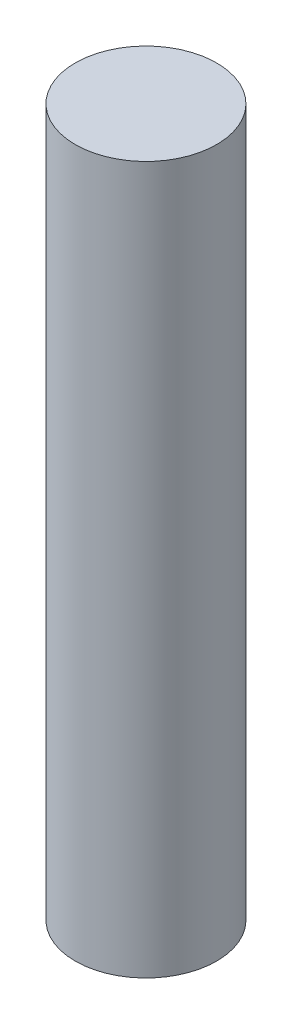
ISO-10303-21;
HEADER;
FILE_DESCRIPTION(('STEP AP214'),'2;1');
FILE_NAME('part.step','',(''),(''),'','','');
FILE_SCHEMA(('AUTOMOTIVE_DESIGN { 1 0 10303 214 1 1 1 1 }'));
ENDSEC;
DATA;
#1=APPLICATION_CONTEXT('core data for automotive mechanical design processes');
#2=APPLICATION_PROTOCOL_DEFINITION('international standard','automotive_design',2000,#1);
#3=PRODUCT_CONTEXT('',#1,'mechanical');
#4=PRODUCT('Part','Part','',(#3));
#5=PRODUCT_RELATED_PRODUCT_CATEGORY('part','',(#4));
#6=PRODUCT_DEFINITION_FORMATION('','',#4);
#7=PRODUCT_DEFINITION_CONTEXT('part definition',#1,'design');
#8=PRODUCT_DEFINITION('design','',#6,#7);
#9=PRODUCT_DEFINITION_SHAPE('','',#8);
#10=(LENGTH_UNIT() NAMED_UNIT(*) SI_UNIT(.MILLI.,.METRE.));
#11=(NAMED_UNIT(*) PLANE_ANGLE_UNIT() SI_UNIT($,.RADIAN.));
#12=(NAMED_UNIT(*) SI_UNIT($,.STERADIAN.) SOLID_ANGLE_UNIT());
#13=UNCERTAINTY_MEASURE_WITH_UNIT(LENGTH_MEASURE(1.E-05),#10,'distance_accuracy_value','');
#14=(GEOMETRIC_REPRESENTATION_CONTEXT(3) GLOBAL_UNCERTAINTY_ASSIGNED_CONTEXT((#13)) GLOBAL_UNIT_ASSIGNED_CONTEXT((#10,
#11,#12)) REPRESENTATION_CONTEXT('',''));
#15=CARTESIAN_POINT('',(0.,0.,0.));
#16=DIRECTION('',(0.,0.,1.));
#17=DIRECTION('',(1.,0.,0.));
#18=AXIS2_PLACEMENT_3D('',#15,#16,#17);
#19=CARTESIAN_POINT('',(0.,15.875,0.));
#20=DIRECTION('',(0.,-1.,0.));
#21=DIRECTION('',(0.,0.,-1.));
#22=AXIS2_PLACEMENT_3D('',#19,#20,#21);
#23=CYLINDRICAL_SURFACE('',#22,1.5875);
#24=CARTESIAN_POINT('',(0.,15.875,0.));
#25=DIRECTION('',(0.,1.,0.));
#26=DIRECTION('',(0.,0.,1.));
#27=AXIS2_PLACEMENT_3D('',#24,#25,#26);
#28=CIRCLE('',#27,1.5875);
#29=CARTESIAN_POINT('',(0.,15.875,1.5875));
#30=VERTEX_POINT('',#29);
#31=EDGE_CURVE('E10',#30,#30,#28,.T.);
#32=ORIENTED_EDGE('',*,*,#31,.F.);
#33=EDGE_LOOP('',(#32));
#34=FACE_BOUND('',#33,.T.);
#35=CARTESIAN_POINT('',(0.,0.,0.));
#36=DIRECTION('',(0.,1.,0.));
#37=DIRECTION('',(0.,0.,1.));
#38=AXIS2_PLACEMENT_3D('',#35,#36,#37);
#39=CIRCLE('',#38,1.5875);
#40=CARTESIAN_POINT('',(0.,0.,1.5875));
#41=VERTEX_POINT('',#40);
#42=EDGE_CURVE('E37',#41,#41,#39,.T.);
#43=ORIENTED_EDGE('',*,*,#42,.T.);
#44=EDGE_LOOP('',(#43));
#45=FACE_BOUND('',#44,.T.);
#46=ADVANCED_FACE('F34',(#34,#45),#23,.T.);
#47=CARTESIAN_POINT('',(0.,15.875,0.));
#48=DIRECTION('',(0.,1.,0.));
#49=DIRECTION('',(0.,0.,1.));
#50=AXIS2_PLACEMENT_3D('',#47,#48,#49);
#51=PLANE('',#50);
#52=ORIENTED_EDGE('',*,*,#31,.T.);
#53=EDGE_LOOP('',(#52));
#54=FACE_BOUND('',#53,.T.);
#55=ADVANCED_FACE('F49',(#54),#51,.T.);
#56=CARTESIAN_POINT('',(0.,0.,0.));
#57=DIRECTION('',(0.,1.,0.));
#58=DIRECTION('',(0.,0.,1.));
#59=AXIS2_PLACEMENT_3D('',#56,#57,#58);
#60=PLANE('',#59);
#61=ORIENTED_EDGE('',*,*,#42,.F.);
#62=EDGE_LOOP('',(#61));
#63=FACE_BOUND('',#62,.T.);
#64=ADVANCED_FACE('F47',(#63),#60,.F.);
#65=CLOSED_SHELL('',(#46,#55,#64));
#66=MANIFOLD_SOLID_BREP('B2',#65);
#67=ADVANCED_BREP_SHAPE_REPRESENTATION('',(#18,#66),#14);
#68=SHAPE_DEFINITION_REPRESENTATION(#9,#67);
ENDSEC;
END-ISO-10303-21;
